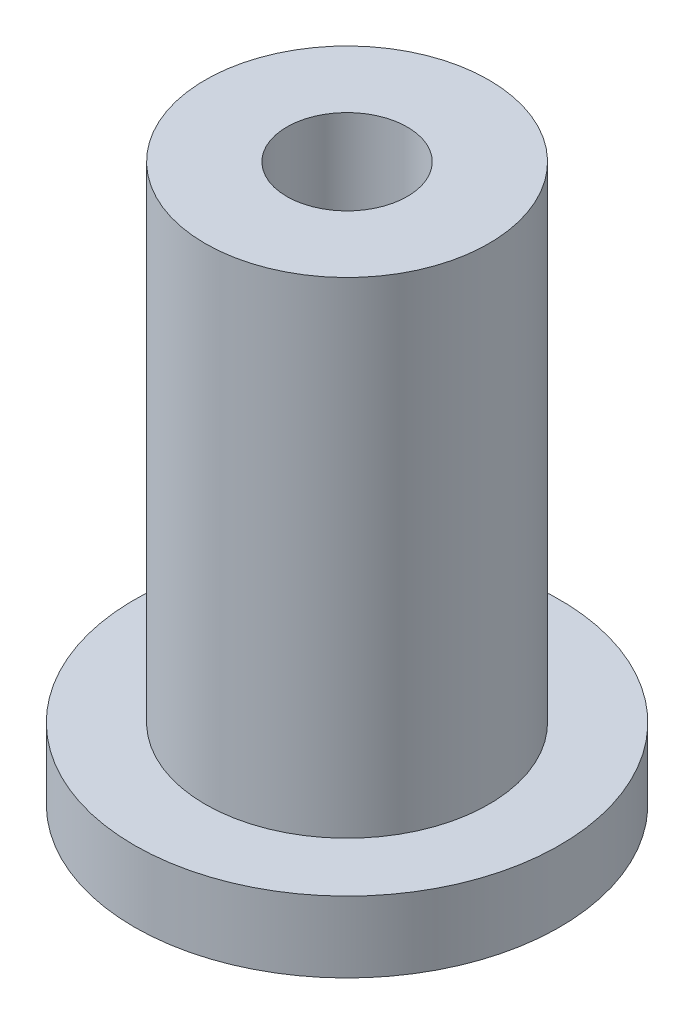
ISO-10303-21;
HEADER;
FILE_DESCRIPTION(('STEP AP214'),'2;1');
FILE_NAME('part.step','',(''),(''),'','','');
FILE_SCHEMA(('AUTOMOTIVE_DESIGN { 1 0 10303 214 1 1 1 1 }'));
ENDSEC;
DATA;
#1=APPLICATION_CONTEXT('core data for automotive mechanical design processes');
#2=APPLICATION_PROTOCOL_DEFINITION('international standard','automotive_design',2000,#1);
#3=PRODUCT_CONTEXT('',#1,'mechanical');
#4=PRODUCT('Part','Part','',(#3));
#5=PRODUCT_RELATED_PRODUCT_CATEGORY('part','',(#4));
#6=PRODUCT_DEFINITION_FORMATION('','',#4);
#7=PRODUCT_DEFINITION_CONTEXT('part definition',#1,'design');
#8=PRODUCT_DEFINITION('design','',#6,#7);
#9=PRODUCT_DEFINITION_SHAPE('','',#8);
#10=(LENGTH_UNIT() NAMED_UNIT(*) SI_UNIT(.MILLI.,.METRE.));
#11=(NAMED_UNIT(*) PLANE_ANGLE_UNIT() SI_UNIT($,.RADIAN.));
#12=(NAMED_UNIT(*) SI_UNIT($,.STERADIAN.) SOLID_ANGLE_UNIT());
#13=UNCERTAINTY_MEASURE_WITH_UNIT(LENGTH_MEASURE(1.E-05),#10,'distance_accuracy_value','');
#14=(GEOMETRIC_REPRESENTATION_CONTEXT(3) GLOBAL_UNCERTAINTY_ASSIGNED_CONTEXT((#13)) GLOBAL_UNIT_ASSIGNED_CONTEXT((#10,
#11,#12)) REPRESENTATION_CONTEXT('',''));
#15=CARTESIAN_POINT('',(0.,0.,0.));
#16=DIRECTION('',(0.,0.,1.));
#17=DIRECTION('',(1.,0.,0.));
#18=AXIS2_PLACEMENT_3D('',#15,#16,#17);
#19=CARTESIAN_POINT('',(137.2,-27.3,306.23));
#20=DIRECTION('',(0.,-1.,0.));
#21=DIRECTION('',(0.,0.,-1.));
#22=AXIS2_PLACEMENT_3D('',#19,#20,#21);
#23=CYLINDRICAL_SURFACE('',#22,6.00000000000001);
#24=CARTESIAN_POINT('',(137.2,-27.3,306.23));
#25=DIRECTION('',(0.,1.,0.));
#26=DIRECTION('',(0.,0.,1.));
#27=AXIS2_PLACEMENT_3D('',#24,#25,#26);
#28=CIRCLE('',#27,6.00000000000001);
#29=CARTESIAN_POINT('',(137.2,-27.3,312.23));
#30=VERTEX_POINT('',#29);
#31=EDGE_CURVE('E10',#30,#30,#28,.T.);
#32=ORIENTED_EDGE('',*,*,#31,.F.);
#33=EDGE_LOOP('',(#32));
#34=FACE_BOUND('',#33,.T.);
#35=CARTESIAN_POINT('',(137.2,-29.3,306.23));
#36=DIRECTION('',(0.,1.,0.));
#37=DIRECTION('',(0.,0.,1.));
#38=AXIS2_PLACEMENT_3D('',#35,#36,#37);
#39=CIRCLE('',#38,6.00000000000001);
#40=CARTESIAN_POINT('',(137.2,-29.3,312.23));
#41=VERTEX_POINT('',#40);
#42=EDGE_CURVE('E42',#41,#41,#39,.T.);
#43=ORIENTED_EDGE('',*,*,#42,.T.);
#44=EDGE_LOOP('',(#43));
#45=FACE_BOUND('',#44,.T.);
#46=ADVANCED_FACE('F41',(#34,#45),#23,.T.);
#47=CARTESIAN_POINT('',(137.2,-27.3,306.23));
#48=DIRECTION('',(0.,1.,0.));
#49=DIRECTION('',(0.,0.,1.));
#50=AXIS2_PLACEMENT_3D('',#47,#48,#49);
#51=PLANE('',#50);
#52=CARTESIAN_POINT('',(137.2,-27.3,306.23));
#53=DIRECTION('',(0.,1.,0.));
#54=DIRECTION('',(0.,0.,1.));
#55=AXIS2_PLACEMENT_3D('',#52,#53,#54);
#56=CIRCLE('',#55,4.);
#57=CARTESIAN_POINT('',(137.2,-27.3,310.23));
#58=VERTEX_POINT('',#57);
#59=EDGE_CURVE('E51',#58,#58,#56,.F.);
#60=ORIENTED_EDGE('',*,*,#59,.T.);
#61=EDGE_LOOP('',(#60));
#62=FACE_BOUND('',#61,.T.);
#63=ORIENTED_EDGE('',*,*,#31,.T.);
#64=EDGE_LOOP('',(#63));
#65=FACE_BOUND('',#64,.T.);
#66=ADVANCED_FACE('F84',(#62,#65),#51,.T.);
#67=CARTESIAN_POINT('',(137.2,-29.3,306.23));
#68=DIRECTION('',(0.,1.,0.));
#69=DIRECTION('',(0.,0.,1.));
#70=AXIS2_PLACEMENT_3D('',#67,#68,#69);
#71=PLANE('',#70);
#72=CARTESIAN_POINT('',(137.2,-29.3,306.23));
#73=DIRECTION('',(0.,1.,0.));
#74=DIRECTION('',(0.,0.,1.));
#75=AXIS2_PLACEMENT_3D('',#72,#73,#74);
#76=CIRCLE('',#75,1.70000000000001);
#77=CARTESIAN_POINT('',(137.2,-29.3,307.93));
#78=VERTEX_POINT('',#77);
#79=EDGE_CURVE('E56',#78,#78,#76,.T.);
#80=ORIENTED_EDGE('',*,*,#79,.T.);
#81=EDGE_LOOP('',(#80));
#82=FACE_BOUND('',#81,.T.);
#83=ORIENTED_EDGE('',*,*,#42,.F.);
#84=EDGE_LOOP('',(#83));
#85=FACE_BOUND('',#84,.T.);
#86=ADVANCED_FACE('F77',(#82,#85),#71,.F.);
#87=CARTESIAN_POINT('',(137.2,-13.6,306.23));
#88=DIRECTION('',(0.,-1.,0.));
#89=DIRECTION('',(0.,0.,-1.));
#90=AXIS2_PLACEMENT_3D('',#87,#88,#89);
#91=CYLINDRICAL_SURFACE('',#90,4.);
#92=ORIENTED_EDGE('',*,*,#59,.F.);
#93=EDGE_LOOP('',(#92));
#94=FACE_BOUND('',#93,.T.);
#95=CARTESIAN_POINT('',(137.2,-13.6,306.23));
#96=DIRECTION('',(0.,1.,0.));
#97=DIRECTION('',(0.,0.,1.));
#98=AXIS2_PLACEMENT_3D('',#95,#96,#97);
#99=CIRCLE('',#98,4.);
#100=CARTESIAN_POINT('',(137.2,-13.6,310.23));
#101=VERTEX_POINT('',#100);
#102=EDGE_CURVE('E54',#101,#101,#99,.T.);
#103=ORIENTED_EDGE('',*,*,#102,.F.);
#104=EDGE_LOOP('',(#103));
#105=FACE_BOUND('',#104,.T.);
#106=ADVANCED_FACE('F72',(#94,#105),#91,.T.);
#107=CARTESIAN_POINT('',(137.2,-13.6,306.23));
#108=DIRECTION('',(0.,1.,0.));
#109=DIRECTION('',(0.,0.,1.));
#110=AXIS2_PLACEMENT_3D('',#107,#108,#109);
#111=PLANE('',#110);
#112=CARTESIAN_POINT('',(137.2,-13.6,306.23));
#113=DIRECTION('',(0.,1.,0.));
#114=DIRECTION('',(0.,0.,1.));
#115=AXIS2_PLACEMENT_3D('',#112,#113,#114);
#116=CIRCLE('',#115,1.70000000000001);
#117=CARTESIAN_POINT('',(137.2,-13.6,307.93));
#118=VERTEX_POINT('',#117);
#119=EDGE_CURVE('E59',#118,#118,#116,.T.);
#120=ORIENTED_EDGE('',*,*,#119,.F.);
#121=EDGE_LOOP('',(#120));
#122=FACE_BOUND('',#121,.T.);
#123=ORIENTED_EDGE('',*,*,#102,.T.);
#124=EDGE_LOOP('',(#123));
#125=FACE_BOUND('',#124,.T.);
#126=ADVANCED_FACE('F69',(#122,#125),#111,.T.);
#127=CARTESIAN_POINT('',(137.2,-13.6,306.23));
#128=DIRECTION('',(0.,-1.,0.));
#129=DIRECTION('',(0.,0.,-1.));
#130=AXIS2_PLACEMENT_3D('',#127,#128,#129);
#131=CYLINDRICAL_SURFACE('',#130,1.70000000000001);
#132=ORIENTED_EDGE('',*,*,#119,.T.);
#133=EDGE_LOOP('',(#132));
#134=FACE_BOUND('',#133,.T.);
#135=ORIENTED_EDGE('',*,*,#79,.F.);
#136=EDGE_LOOP('',(#135));
#137=FACE_BOUND('',#136,.T.);
#138=ADVANCED_FACE('F63',(#134,#137),#131,.F.);
#139=CLOSED_SHELL('',(#46,#66,#86,#106,#126,#138));
#140=MANIFOLD_SOLID_BREP('B2',#139);
#141=ADVANCED_BREP_SHAPE_REPRESENTATION('',(#18,#140),#14);
#142=SHAPE_DEFINITION_REPRESENTATION(#9,#141);
ENDSEC;
END-ISO-10303-21;
